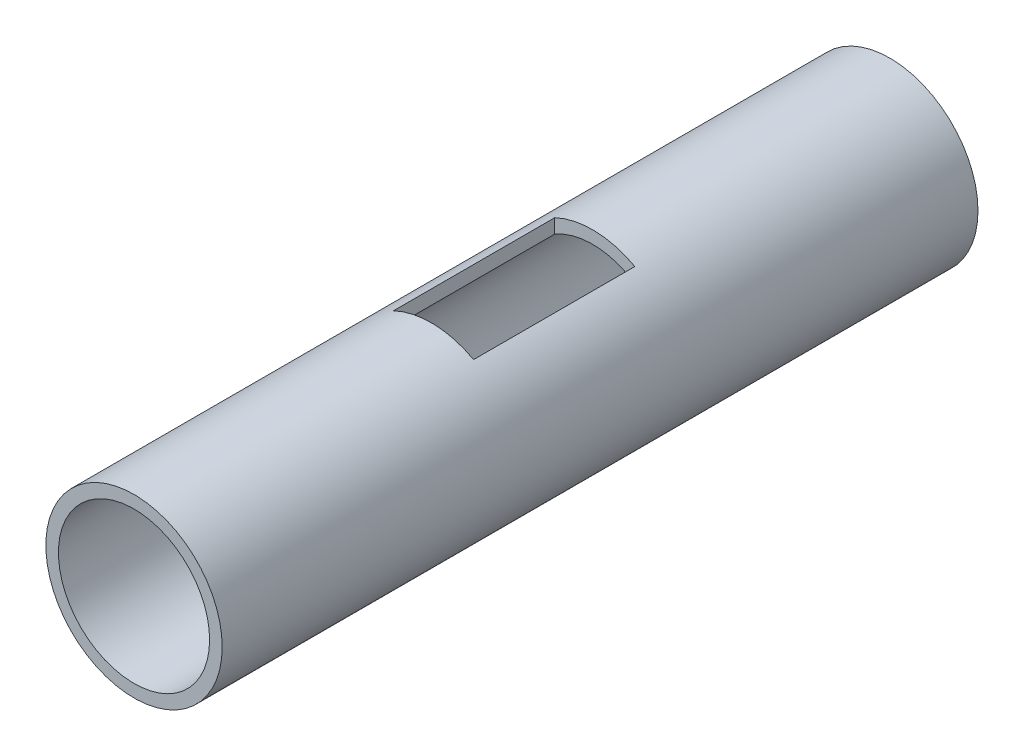
ISO-10303-21;
HEADER;
FILE_DESCRIPTION(('STEP AP214'),'2;1');
FILE_NAME('part.step','',(''),(''),'','','');
FILE_SCHEMA(('AUTOMOTIVE_DESIGN { 1 0 10303 214 1 1 1 1 }'));
ENDSEC;
DATA;
#1=APPLICATION_CONTEXT('core data for automotive mechanical design processes');
#2=APPLICATION_PROTOCOL_DEFINITION('international standard','automotive_design',2000,#1);
#3=PRODUCT_CONTEXT('',#1,'mechanical');
#4=PRODUCT('Part','Part','',(#3));
#5=PRODUCT_RELATED_PRODUCT_CATEGORY('part','',(#4));
#6=PRODUCT_DEFINITION_FORMATION('','',#4);
#7=PRODUCT_DEFINITION_CONTEXT('part definition',#1,'design');
#8=PRODUCT_DEFINITION('design','',#6,#7);
#9=PRODUCT_DEFINITION_SHAPE('','',#8);
#10=(LENGTH_UNIT() NAMED_UNIT(*) SI_UNIT(.MILLI.,.METRE.));
#11=(NAMED_UNIT(*) PLANE_ANGLE_UNIT() SI_UNIT($,.RADIAN.));
#12=(NAMED_UNIT(*) SI_UNIT($,.STERADIAN.) SOLID_ANGLE_UNIT());
#13=UNCERTAINTY_MEASURE_WITH_UNIT(LENGTH_MEASURE(1.E-05),#10,'distance_accuracy_value','');
#14=(GEOMETRIC_REPRESENTATION_CONTEXT(3) GLOBAL_UNCERTAINTY_ASSIGNED_CONTEXT((#13)) GLOBAL_UNIT_ASSIGNED_CONTEXT((#10,
#11,#12)) REPRESENTATION_CONTEXT('',''));
#15=CARTESIAN_POINT('',(0.,0.,0.));
#16=DIRECTION('',(0.,0.,1.));
#17=DIRECTION('',(1.,0.,0.));
#18=AXIS2_PLACEMENT_3D('',#15,#16,#17);
#19=CARTESIAN_POINT('',(-19.4421806111956,6.39869235305172,60.));
#20=DIRECTION('',(0.,0.,-1.));
#21=DIRECTION('',(-1.,0.,0.));
#22=AXIS2_PLACEMENT_3D('',#19,#20,#21);
#23=CYLINDRICAL_SURFACE('',#22,7.);
#24=CARTESIAN_POINT('',(-19.4421806111956,6.39869235305172,36.3967597997299));
#25=DIRECTION('',(0.,0.,1.));
#26=DIRECTION('',(1.,0.,0.));
#27=AXIS2_PLACEMENT_3D('',#24,#25,#26);
#28=CIRCLE('',#27,7.);
#29=CARTESIAN_POINT('',(-16.0867537035827,12.5420717380212,36.3967597997299));
#30=VERTEX_POINT('',#29);
#31=CARTESIAN_POINT('',(-22.4445149009114,12.7221398947648,36.3967597997299));
#32=VERTEX_POINT('',#31);
#33=EDGE_CURVE('E155',#30,#32,#28,.T.);
#34=ORIENTED_EDGE('',*,*,#33,.T.);
#35=DIRECTION('',(0.,0.,-1.));
#36=VECTOR('',#35,1.);
#37=CARTESIAN_POINT('',(-22.4445149009114,12.7221398947648,60.));
#38=LINE('',#37,#36);
#39=CARTESIAN_POINT('',(-22.4445149009114,12.7221398947648,23.6));
#40=VERTEX_POINT('',#39);
#41=EDGE_CURVE('E141',#32,#40,#38,.T.);
#42=ORIENTED_EDGE('',*,*,#41,.T.);
#43=CARTESIAN_POINT('',(-19.4421806111956,6.39869235305172,23.6));
#44=DIRECTION('',(0.,0.,-1.));
#45=DIRECTION('',(-1.,0.,0.));
#46=AXIS2_PLACEMENT_3D('',#43,#44,#45);
#47=CIRCLE('',#46,7.);
#48=CARTESIAN_POINT('',(-16.0867537035827,12.5420717380212,23.6));
#49=VERTEX_POINT('',#48);
#50=EDGE_CURVE('E147',#40,#49,#47,.T.);
#51=ORIENTED_EDGE('',*,*,#50,.T.);
#52=DIRECTION('',(0.,0.,-1.));
#53=VECTOR('',#52,1.);
#54=CARTESIAN_POINT('',(-16.0867537035827,12.5420717380212,60.));
#55=LINE('',#54,#53);
#56=EDGE_CURVE('E152',#49,#30,#55,.F.);
#57=ORIENTED_EDGE('',*,*,#56,.T.);
#58=EDGE_LOOP('',(#34,#42,#51,#57));
#59=FACE_BOUND('',#58,.T.);
#60=CARTESIAN_POINT('',(-16.0867537035827,0.255312968082295,23.6));
#61=VERTEX_POINT('',#60);
#62=CARTESIAN_POINT('',(-22.4445149009114,0.0752448113386693,23.6));
#63=VERTEX_POINT('',#62);
#64=EDGE_CURVE('E148',#61,#63,#47,.T.);
#65=ORIENTED_EDGE('',*,*,#64,.T.);
#66=DIRECTION('',(0.,0.,-1.));
#67=VECTOR('',#66,1.);
#68=CARTESIAN_POINT('',(-22.4445149009114,0.0752448113386693,60.));
#69=LINE('',#68,#67);
#70=CARTESIAN_POINT('',(-22.4445149009114,0.0752448113386693,36.3967597997299));
#71=VERTEX_POINT('',#70);
#72=EDGE_CURVE('E144',#63,#71,#69,.F.);
#73=ORIENTED_EDGE('',*,*,#72,.T.);
#74=CARTESIAN_POINT('',(-16.0867537035827,0.255312968082295,36.3967597997299));
#75=VERTEX_POINT('',#74);
#76=EDGE_CURVE('E156',#71,#75,#28,.T.);
#77=ORIENTED_EDGE('',*,*,#76,.T.);
#78=DIRECTION('',(0.,0.,-1.));
#79=VECTOR('',#78,1.);
#80=CARTESIAN_POINT('',(-16.0867537035827,0.255312968082295,60.));
#81=LINE('',#80,#79);
#82=EDGE_CURVE('E111',#75,#61,#81,.T.);
#83=ORIENTED_EDGE('',*,*,#82,.T.);
#84=EDGE_LOOP('',(#65,#73,#77,#83));
#85=FACE_BOUND('',#84,.T.);
#86=CARTESIAN_POINT('',(-19.4421806111956,6.39869235305172,60.));
#87=DIRECTION('',(0.,0.,1.));
#88=DIRECTION('',(1.,0.,0.));
#89=AXIS2_PLACEMENT_3D('',#86,#87,#88);
#90=CIRCLE('',#89,7.);
#91=CARTESIAN_POINT('',(-12.4421806111956,6.39869235305172,60.));
#92=VERTEX_POINT('',#91);
#93=EDGE_CURVE('E129',#92,#92,#90,.T.);
#94=ORIENTED_EDGE('',*,*,#93,.F.);
#95=EDGE_LOOP('',(#94));
#96=FACE_BOUND('',#95,.T.);
#97=CARTESIAN_POINT('',(-19.4421806111956,6.39869235305172,0.));
#98=DIRECTION('',(0.,0.,1.));
#99=DIRECTION('',(1.,0.,0.));
#100=AXIS2_PLACEMENT_3D('',#97,#98,#99);
#101=CIRCLE('',#100,7.);
#102=CARTESIAN_POINT('',(-12.4421806111956,6.39869235305172,0.));
#103=VERTEX_POINT('',#102);
#104=EDGE_CURVE('E133',#103,#103,#101,.T.);
#105=ORIENTED_EDGE('',*,*,#104,.T.);
#106=EDGE_LOOP('',(#105));
#107=FACE_BOUND('',#106,.T.);
#108=ADVANCED_FACE('F33',(#59,#85,#96,#107),#23,.T.);
#109=CARTESIAN_POINT('',(-19.4421806111956,6.39869235305172,60.));
#110=DIRECTION('',(0.,0.,1.));
#111=DIRECTION('',(1.,0.,0.));
#112=AXIS2_PLACEMENT_3D('',#109,#110,#111);
#113=PLANE('',#112);
#114=CARTESIAN_POINT('',(-19.4421806111956,6.39869235305172,60.));
#115=DIRECTION('',(0.,0.,1.));
#116=DIRECTION('',(1.,0.,0.));
#117=AXIS2_PLACEMENT_3D('',#114,#115,#116);
#118=CIRCLE('',#117,6.);
#119=CARTESIAN_POINT('',(-13.4421806111956,6.39869235305172,60.));
#120=VERTEX_POINT('',#119);
#121=EDGE_CURVE('E134',#120,#120,#118,.T.);
#122=ORIENTED_EDGE('',*,*,#121,.F.);
#123=EDGE_LOOP('',(#122));
#124=FACE_BOUND('',#123,.T.);
#125=ORIENTED_EDGE('',*,*,#93,.T.);
#126=EDGE_LOOP('',(#125));
#127=FACE_BOUND('',#126,.T.);
#128=ADVANCED_FACE('F188',(#124,#127),#113,.T.);
#129=CARTESIAN_POINT('',(-19.4421806111956,6.39869235305172,0.));
#130=DIRECTION('',(0.,0.,1.));
#131=DIRECTION('',(1.,0.,0.));
#132=AXIS2_PLACEMENT_3D('',#129,#130,#131);
#133=PLANE('',#132);
#134=CARTESIAN_POINT('',(-19.4421806111956,6.39869235305172,0.));
#135=DIRECTION('',(0.,0.,1.));
#136=DIRECTION('',(1.,0.,0.));
#137=AXIS2_PLACEMENT_3D('',#134,#135,#136);
#138=CIRCLE('',#137,6.);
#139=CARTESIAN_POINT('',(-13.4421806111956,6.39869235305172,0.));
#140=VERTEX_POINT('',#139);
#141=EDGE_CURVE('E130',#140,#140,#138,.T.);
#142=ORIENTED_EDGE('',*,*,#141,.T.);
#143=EDGE_LOOP('',(#142));
#144=FACE_BOUND('',#143,.T.);
#145=ORIENTED_EDGE('',*,*,#104,.F.);
#146=EDGE_LOOP('',(#145));
#147=FACE_BOUND('',#146,.T.);
#148=ADVANCED_FACE('F193',(#144,#147),#133,.F.);
#149=CARTESIAN_POINT('',(-19.4421806111956,6.39869235305172,-11.));
#150=DIRECTION('',(0.,0.,1.));
#151=DIRECTION('',(1.,0.,0.));
#152=AXIS2_PLACEMENT_3D('',#149,#150,#151);
#153=CYLINDRICAL_SURFACE('',#152,6.);
#154=CARTESIAN_POINT('',(-19.4421806111956,6.39869235305172,36.3967597997299));
#155=DIRECTION('',(0.,0.,1.));
#156=DIRECTION('',(1.,0.,0.));
#157=AXIS2_PLACEMENT_3D('',#154,#155,#156);
#158=CIRCLE('',#157,6.);
#159=CARTESIAN_POINT('',(-16.0867537035827,1.42464869947696,36.3967597997299));
#160=VERTEX_POINT('',#159);
#161=CARTESIAN_POINT('',(-22.4445149009114,1.20388833241756,36.3967597997299));
#162=VERTEX_POINT('',#161);
#163=EDGE_CURVE('E95',#160,#162,#158,.F.);
#164=ORIENTED_EDGE('',*,*,#163,.T.);
#165=DIRECTION('',(0.,0.,1.));
#166=VECTOR('',#165,1.);
#167=CARTESIAN_POINT('',(-22.4445149009114,1.20388833241756,-11.));
#168=LINE('',#167,#166);
#169=CARTESIAN_POINT('',(-22.4445149009114,1.20388833241756,23.6));
#170=VERTEX_POINT('',#169);
#171=EDGE_CURVE('E11',#162,#170,#168,.F.);
#172=ORIENTED_EDGE('',*,*,#171,.T.);
#173=CARTESIAN_POINT('',(-19.4421806111956,6.39869235305172,23.6));
#174=DIRECTION('',(0.,0.,-1.));
#175=DIRECTION('',(-1.,0.,0.));
#176=AXIS2_PLACEMENT_3D('',#173,#174,#175);
#177=CIRCLE('',#176,6.);
#178=CARTESIAN_POINT('',(-16.0867537035827,1.42464869947696,23.6));
#179=VERTEX_POINT('',#178);
#180=EDGE_CURVE('E40',#170,#179,#177,.F.);
#181=ORIENTED_EDGE('',*,*,#180,.T.);
#182=DIRECTION('',(0.,0.,1.));
#183=VECTOR('',#182,1.);
#184=CARTESIAN_POINT('',(-16.0867537035827,1.42464869947696,-11.));
#185=LINE('',#184,#183);
#186=EDGE_CURVE('E102',#179,#160,#185,.T.);
#187=ORIENTED_EDGE('',*,*,#186,.T.);
#188=EDGE_LOOP('',(#164,#172,#181,#187));
#189=FACE_BOUND('',#188,.T.);
#190=CARTESIAN_POINT('',(-16.0867537035827,11.3727360066265,23.6));
#191=VERTEX_POINT('',#190);
#192=CARTESIAN_POINT('',(-22.4445149009114,11.5934963736859,23.6));
#193=VERTEX_POINT('',#192);
#194=EDGE_CURVE('E120',#191,#193,#177,.F.);
#195=ORIENTED_EDGE('',*,*,#194,.T.);
#196=DIRECTION('',(0.,0.,1.));
#197=VECTOR('',#196,1.);
#198=CARTESIAN_POINT('',(-22.4445149009114,11.5934963736859,-11.));
#199=LINE('',#198,#197);
#200=CARTESIAN_POINT('',(-22.4445149009114,11.5934963736859,36.3967597997299));
#201=VERTEX_POINT('',#200);
#202=EDGE_CURVE('E103',#193,#201,#199,.T.);
#203=ORIENTED_EDGE('',*,*,#202,.T.);
#204=CARTESIAN_POINT('',(-16.0867537035827,11.3727360066265,36.3967597997299));
#205=VERTEX_POINT('',#204);
#206=EDGE_CURVE('E105',#201,#205,#158,.F.);
#207=ORIENTED_EDGE('',*,*,#206,.T.);
#208=DIRECTION('',(0.,0.,1.));
#209=VECTOR('',#208,1.);
#210=CARTESIAN_POINT('',(-16.0867537035827,11.3727360066265,-11.));
#211=LINE('',#210,#209);
#212=EDGE_CURVE('E125',#205,#191,#211,.F.);
#213=ORIENTED_EDGE('',*,*,#212,.T.);
#214=EDGE_LOOP('',(#195,#203,#207,#213));
#215=FACE_BOUND('',#214,.T.);
#216=ORIENTED_EDGE('',*,*,#121,.T.);
#217=EDGE_LOOP('',(#216));
#218=FACE_BOUND('',#217,.T.);
#219=ORIENTED_EDGE('',*,*,#141,.F.);
#220=EDGE_LOOP('',(#219));
#221=FACE_BOUND('',#220,.T.);
#222=ADVANCED_FACE('F117',(#189,#215,#218,#221),#153,.F.);
#223=CARTESIAN_POINT('',(-22.4445149009114,-21.,36.3967597997299));
#224=DIRECTION('',(0.,0.,1.));
#225=DIRECTION('',(1.,0.,0.));
#226=AXIS2_PLACEMENT_3D('',#223,#224,#225);
#227=PLANE('',#226);
#228=DIRECTION('',(0.,1.,0.));
#229=VECTOR('',#228,1.);
#230=CARTESIAN_POINT('',(-16.0867537035827,-21.,36.3967597997299));
#231=LINE('',#230,#229);
#232=EDGE_CURVE('E114',#205,#30,#231,.T.);
#233=ORIENTED_EDGE('',*,*,#232,.F.);
#234=ORIENTED_EDGE('',*,*,#206,.F.);
#235=DIRECTION('',(0.,1.,0.));
#236=VECTOR('',#235,1.);
#237=CARTESIAN_POINT('',(-22.4445149009114,-21.,36.3967597997299));
#238=LINE('',#237,#236);
#239=EDGE_CURVE('E47',#201,#32,#238,.T.);
#240=ORIENTED_EDGE('',*,*,#239,.T.);
#241=ORIENTED_EDGE('',*,*,#33,.F.);
#242=EDGE_LOOP('',(#233,#234,#240,#241));
#243=FACE_BOUND('',#242,.T.);
#244=ADVANCED_FACE('F198',(#243),#227,.F.);
#245=CARTESIAN_POINT('',(-16.0867537035827,-21.,23.6));
#246=DIRECTION('',(1.,0.,0.));
#247=DIRECTION('',(0.,0.,-1.));
#248=AXIS2_PLACEMENT_3D('',#245,#246,#247);
#249=PLANE('',#248);
#250=DIRECTION('',(0.,1.,0.));
#251=VECTOR('',#250,1.);
#252=CARTESIAN_POINT('',(-16.0867537035827,-21.,23.6));
#253=LINE('',#252,#251);
#254=EDGE_CURVE('E113',#191,#49,#253,.T.);
#255=ORIENTED_EDGE('',*,*,#254,.F.);
#256=ORIENTED_EDGE('',*,*,#212,.F.);
#257=ORIENTED_EDGE('',*,*,#232,.T.);
#258=ORIENTED_EDGE('',*,*,#56,.F.);
#259=EDGE_LOOP('',(#255,#256,#257,#258));
#260=FACE_BOUND('',#259,.T.);
#261=ADVANCED_FACE('F202',(#260),#249,.F.);
#262=CARTESIAN_POINT('',(-22.4445149009114,-21.,23.6));
#263=DIRECTION('',(0.,0.,-1.));
#264=DIRECTION('',(-1.,0.,0.));
#265=AXIS2_PLACEMENT_3D('',#262,#263,#264);
#266=PLANE('',#265);
#267=DIRECTION('',(0.,1.,0.));
#268=VECTOR('',#267,1.);
#269=CARTESIAN_POINT('',(-22.4445149009114,-21.,23.6));
#270=LINE('',#269,#268);
#271=EDGE_CURVE('E164',#193,#40,#270,.T.);
#272=ORIENTED_EDGE('',*,*,#271,.F.);
#273=ORIENTED_EDGE('',*,*,#194,.F.);
#274=ORIENTED_EDGE('',*,*,#254,.T.);
#275=ORIENTED_EDGE('',*,*,#50,.F.);
#276=EDGE_LOOP('',(#272,#273,#274,#275));
#277=FACE_BOUND('',#276,.T.);
#278=ADVANCED_FACE('F184',(#277),#266,.F.);
#279=CARTESIAN_POINT('',(-22.4445149009114,-21.,23.6));
#280=DIRECTION('',(-1.,0.,0.));
#281=DIRECTION('',(0.,0.,1.));
#282=AXIS2_PLACEMENT_3D('',#279,#280,#281);
#283=PLANE('',#282);
#284=ORIENTED_EDGE('',*,*,#239,.F.);
#285=ORIENTED_EDGE('',*,*,#202,.F.);
#286=ORIENTED_EDGE('',*,*,#271,.T.);
#287=ORIENTED_EDGE('',*,*,#41,.F.);
#288=EDGE_LOOP('',(#284,#285,#286,#287));
#289=FACE_BOUND('',#288,.T.);
#290=ADVANCED_FACE('F177',(#289),#283,.F.);
#291=EDGE_CURVE('E158',#63,#170,#270,.T.);
#292=ORIENTED_EDGE('',*,*,#291,.T.);
#293=ORIENTED_EDGE('',*,*,#171,.F.);
#294=EDGE_CURVE('E98',#71,#162,#238,.T.);
#295=ORIENTED_EDGE('',*,*,#294,.F.);
#296=ORIENTED_EDGE('',*,*,#72,.F.);
#297=EDGE_LOOP('',(#292,#293,#295,#296));
#298=FACE_BOUND('',#297,.T.);
#299=ADVANCED_FACE('F175',(#298),#283,.F.);
#300=EDGE_CURVE('E163',#61,#179,#253,.T.);
#301=ORIENTED_EDGE('',*,*,#300,.T.);
#302=ORIENTED_EDGE('',*,*,#180,.F.);
#303=ORIENTED_EDGE('',*,*,#291,.F.);
#304=ORIENTED_EDGE('',*,*,#64,.F.);
#305=EDGE_LOOP('',(#301,#302,#303,#304));
#306=FACE_BOUND('',#305,.T.);
#307=ADVANCED_FACE('F170',(#306),#266,.F.);
#308=EDGE_CURVE('E55',#75,#160,#231,.T.);
#309=ORIENTED_EDGE('',*,*,#308,.T.);
#310=ORIENTED_EDGE('',*,*,#186,.F.);
#311=ORIENTED_EDGE('',*,*,#300,.F.);
#312=ORIENTED_EDGE('',*,*,#82,.F.);
#313=EDGE_LOOP('',(#309,#310,#311,#312));
#314=FACE_BOUND('',#313,.T.);
#315=ADVANCED_FACE('F107',(#314),#249,.F.);
#316=ORIENTED_EDGE('',*,*,#294,.T.);
#317=ORIENTED_EDGE('',*,*,#163,.F.);
#318=ORIENTED_EDGE('',*,*,#308,.F.);
#319=ORIENTED_EDGE('',*,*,#76,.F.);
#320=EDGE_LOOP('',(#316,#317,#318,#319));
#321=FACE_BOUND('',#320,.T.);
#322=ADVANCED_FACE('F96',(#321),#227,.F.);
#323=CLOSED_SHELL('',(#108,#128,#148,#222,#244,#261,#278,#290,#299,#307,#315,#322));
#324=MANIFOLD_SOLID_BREP('B2',#323);
#325=ADVANCED_BREP_SHAPE_REPRESENTATION('',(#18,#324),#14);
#326=SHAPE_DEFINITION_REPRESENTATION(#9,#325);
ENDSEC;
END-ISO-10303-21;
